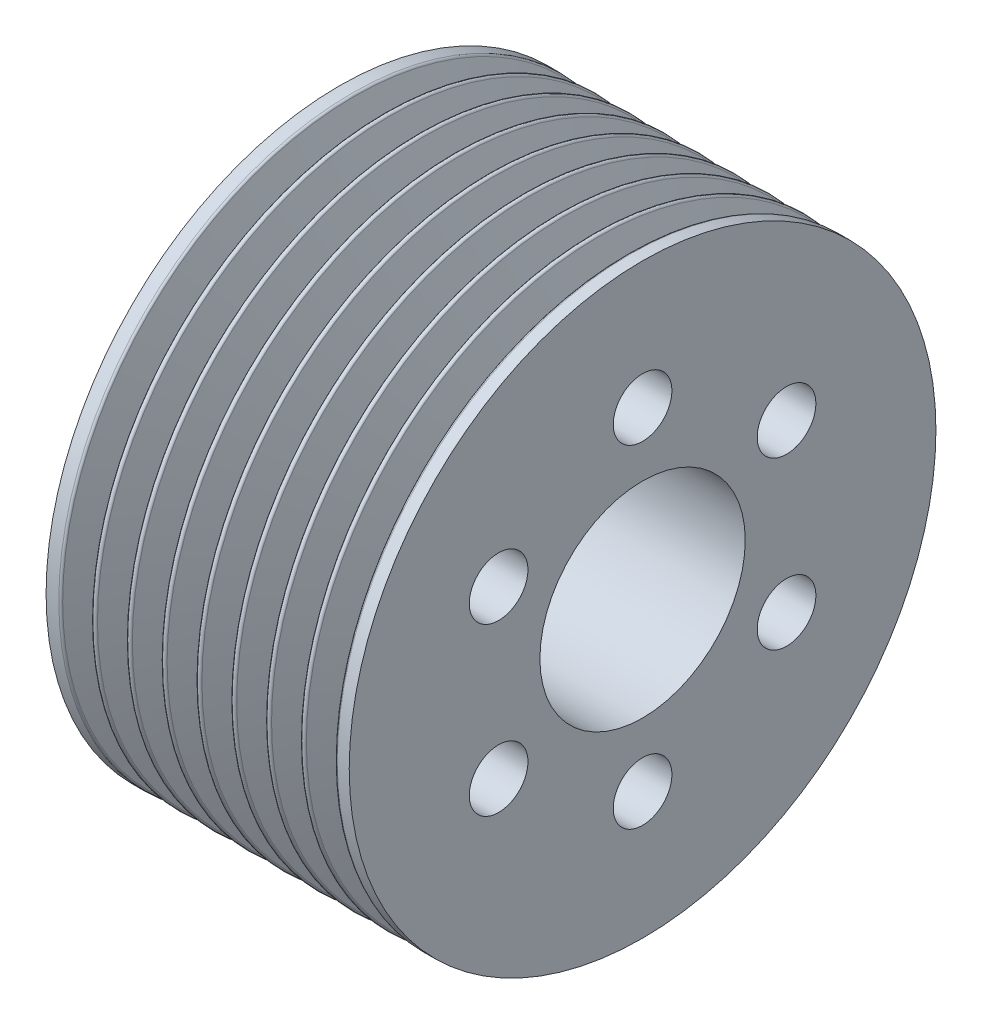
ISO-10303-21;
HEADER;
FILE_DESCRIPTION(('STEP AP214'),'2;1');
FILE_NAME('part.step','',(''),(''),'','','');
FILE_SCHEMA(('AUTOMOTIVE_DESIGN { 1 0 10303 214 1 1 1 1 }'));
ENDSEC;
DATA;
#1=APPLICATION_CONTEXT('core data for automotive mechanical design processes');
#2=APPLICATION_PROTOCOL_DEFINITION('international standard','automotive_design',2000,#1);
#3=PRODUCT_CONTEXT('',#1,'mechanical');
#4=PRODUCT('Part','Part','',(#3));
#5=PRODUCT_RELATED_PRODUCT_CATEGORY('part','',(#4));
#6=PRODUCT_DEFINITION_FORMATION('','',#4);
#7=PRODUCT_DEFINITION_CONTEXT('part definition',#1,'design');
#8=PRODUCT_DEFINITION('design','',#6,#7);
#9=PRODUCT_DEFINITION_SHAPE('','',#8);
#10=(LENGTH_UNIT() NAMED_UNIT(*) SI_UNIT(.MILLI.,.METRE.));
#11=(NAMED_UNIT(*) PLANE_ANGLE_UNIT() SI_UNIT($,.RADIAN.));
#12=(NAMED_UNIT(*) SI_UNIT($,.STERADIAN.) SOLID_ANGLE_UNIT());
#13=UNCERTAINTY_MEASURE_WITH_UNIT(LENGTH_MEASURE(1.E-05),#10,'distance_accuracy_value','');
#14=(GEOMETRIC_REPRESENTATION_CONTEXT(3) GLOBAL_UNCERTAINTY_ASSIGNED_CONTEXT((#13)) GLOBAL_UNIT_ASSIGNED_CONTEXT((#10,
#11,#12)) REPRESENTATION_CONTEXT('',''));
#15=CARTESIAN_POINT('',(0.,0.,0.));
#16=DIRECTION('',(0.,0.,1.));
#17=DIRECTION('',(1.,0.,0.));
#18=AXIS2_PLACEMENT_3D('',#15,#16,#17);
#19=CARTESIAN_POINT('',(0.,0.,0.));
#20=DIRECTION('',(-1.,0.,0.));
#21=DIRECTION('',(0.,0.,1.));
#22=AXIS2_PLACEMENT_3D('',#19,#20,#21);
#23=CYLINDRICAL_SURFACE('',#22,30.);
#24=CARTESIAN_POINT('',(18.,0.,0.));
#25=DIRECTION('',(-1.,0.,0.));
#26=DIRECTION('',(0.,0.,1.));
#27=AXIS2_PLACEMENT_3D('',#24,#25,#26);
#28=CIRCLE('',#27,30.);
#29=CARTESIAN_POINT('',(18.,0.,30.));
#30=VERTEX_POINT('',#29);
#31=EDGE_CURVE('E54',#30,#30,#28,.T.);
#32=ORIENTED_EDGE('',*,*,#31,.F.);
#33=EDGE_LOOP('',(#32));
#34=FACE_BOUND('',#33,.T.);
#35=CARTESIAN_POINT('',(19.3,0.,0.));
#36=DIRECTION('',(-1.,0.,0.));
#37=DIRECTION('',(0.,0.,1.));
#38=AXIS2_PLACEMENT_3D('',#35,#36,#37);
#39=CIRCLE('',#38,30.);
#40=CARTESIAN_POINT('',(19.3,0.,30.));
#41=VERTEX_POINT('',#40);
#42=EDGE_CURVE('E205',#41,#41,#39,.T.);
#43=ORIENTED_EDGE('',*,*,#42,.T.);
#44=EDGE_LOOP('',(#43));
#45=FACE_BOUND('',#44,.T.);
#46=ADVANCED_FACE('F41',(#34,#45),#23,.T.);
#47=CARTESIAN_POINT('',(31.5,10.5,0.));
#48=DIRECTION('',(1.,0.,0.));
#49=DIRECTION('',(0.,0.,-1.));
#50=AXIS2_PLACEMENT_3D('',#47,#48,#49);
#51=PLANE('',#50);
#52=CARTESIAN_POINT('',(31.5,8.50000000000017,14.7224318643354));
#53=DIRECTION('',(1.,0.,0.));
#54=DIRECTION('',(0.,0.,-1.));
#55=AXIS2_PLACEMENT_3D('',#52,#53,#54);
#56=CIRCLE('',#55,3.);
#57=CARTESIAN_POINT('',(31.5,8.50000000000017,11.7224318643354));
#58=VERTEX_POINT('',#57);
#59=EDGE_CURVE('E249',#58,#58,#56,.F.);
#60=ORIENTED_EDGE('',*,*,#59,.F.);
#61=EDGE_LOOP('',(#60));
#62=FACE_BOUND('',#61,.T.);
#63=CARTESIAN_POINT('',(31.5,-8.50000000000004,14.7224318643355));
#64=DIRECTION('',(1.,0.,0.));
#65=DIRECTION('',(0.,0.,-1.));
#66=AXIS2_PLACEMENT_3D('',#63,#64,#65);
#67=CIRCLE('',#66,3.);
#68=CARTESIAN_POINT('',(31.5,-8.50000000000004,11.7224318643355));
#69=VERTEX_POINT('',#68);
#70=EDGE_CURVE('E241',#69,#69,#67,.F.);
#71=ORIENTED_EDGE('',*,*,#70,.F.);
#72=EDGE_LOOP('',(#71));
#73=FACE_BOUND('',#72,.T.);
#74=CARTESIAN_POINT('',(31.5,-17.0000000000001,0.));
#75=DIRECTION('',(1.,0.,0.));
#76=DIRECTION('',(0.,0.,-1.));
#77=AXIS2_PLACEMENT_3D('',#74,#75,#76);
#78=CIRCLE('',#77,3.);
#79=CARTESIAN_POINT('',(31.5,-17.0000000000001,-2.99999999999996));
#80=VERTEX_POINT('',#79);
#81=EDGE_CURVE('E233',#80,#80,#78,.F.);
#82=ORIENTED_EDGE('',*,*,#81,.F.);
#83=EDGE_LOOP('',(#82));
#84=FACE_BOUND('',#83,.T.);
#85=CARTESIAN_POINT('',(31.5,-8.49999999999999,-14.7224318643355));
#86=DIRECTION('',(1.,0.,0.));
#87=DIRECTION('',(0.,0.,-1.));
#88=AXIS2_PLACEMENT_3D('',#85,#86,#87);
#89=CIRCLE('',#88,3.);
#90=CARTESIAN_POINT('',(31.5,-8.49999999999999,-17.7224318643355));
#91=VERTEX_POINT('',#90);
#92=EDGE_CURVE('E225',#91,#91,#89,.F.);
#93=ORIENTED_EDGE('',*,*,#92,.F.);
#94=EDGE_LOOP('',(#93));
#95=FACE_BOUND('',#94,.T.);
#96=CARTESIAN_POINT('',(31.5,8.5,-14.7224318643355));
#97=DIRECTION('',(1.,0.,0.));
#98=DIRECTION('',(0.,0.,-1.));
#99=AXIS2_PLACEMENT_3D('',#96,#97,#98);
#100=CIRCLE('',#99,3.);
#101=CARTESIAN_POINT('',(31.5,8.5,-17.7224318643355));
#102=VERTEX_POINT('',#101);
#103=EDGE_CURVE('E217',#102,#102,#100,.F.);
#104=ORIENTED_EDGE('',*,*,#103,.F.);
#105=EDGE_LOOP('',(#104));
#106=FACE_BOUND('',#105,.T.);
#107=CARTESIAN_POINT('',(31.5,17.,0.));
#108=DIRECTION('',(1.,0.,0.));
#109=DIRECTION('',(0.,0.,-1.));
#110=AXIS2_PLACEMENT_3D('',#107,#108,#109);
#111=CIRCLE('',#110,3.);
#112=CARTESIAN_POINT('',(31.5,17.,-3.));
#113=VERTEX_POINT('',#112);
#114=EDGE_CURVE('E209',#113,#113,#111,.F.);
#115=ORIENTED_EDGE('',*,*,#114,.F.);
#116=EDGE_LOOP('',(#115));
#117=FACE_BOUND('',#116,.T.);
#118=CARTESIAN_POINT('',(31.5,0.,0.));
#119=DIRECTION('',(-1.,0.,0.));
#120=DIRECTION('',(0.,0.,1.));
#121=AXIS2_PLACEMENT_3D('',#118,#119,#120);
#122=CIRCLE('',#121,10.5);
#123=CARTESIAN_POINT('',(31.5,0.,10.5));
#124=VERTEX_POINT('',#123);
#125=EDGE_CURVE('E69',#124,#124,#122,.T.);
#126=ORIENTED_EDGE('',*,*,#125,.F.);
#127=EDGE_LOOP('',(#126));
#128=FACE_BOUND('',#127,.T.);
#129=CARTESIAN_POINT('',(31.5,0.,0.));
#130=DIRECTION('',(-1.,0.,0.));
#131=DIRECTION('',(0.,0.,1.));
#132=AXIS2_PLACEMENT_3D('',#129,#130,#131);
#133=CIRCLE('',#132,25.);
#134=CARTESIAN_POINT('',(31.5,0.,25.));
#135=VERTEX_POINT('',#134);
#136=EDGE_CURVE('E10',#135,#135,#133,.T.);
#137=ORIENTED_EDGE('',*,*,#136,.T.);
#138=EDGE_LOOP('',(#137));
#139=FACE_BOUND('',#138,.T.);
#140=ADVANCED_FACE('F43',(#62,#73,#84,#95,#106,#117,#128,#139),#51,.F.);
#141=CARTESIAN_POINT('',(0.,0.,0.));
#142=DIRECTION('',(-1.,0.,0.));
#143=DIRECTION('',(0.,0.,1.));
#144=AXIS2_PLACEMENT_3D('',#141,#142,#143);
#145=CYLINDRICAL_SURFACE('',#144,25.);
#146=ORIENTED_EDGE('',*,*,#136,.F.);
#147=EDGE_LOOP('',(#146));
#148=FACE_BOUND('',#147,.T.);
#149=CARTESIAN_POINT('',(18.,0.,0.));
#150=DIRECTION('',(-1.,0.,0.));
#151=DIRECTION('',(0.,0.,1.));
#152=AXIS2_PLACEMENT_3D('',#149,#150,#151);
#153=CIRCLE('',#152,25.);
#154=CARTESIAN_POINT('',(18.,0.,25.));
#155=VERTEX_POINT('',#154);
#156=EDGE_CURVE('E49',#155,#155,#153,.T.);
#157=ORIENTED_EDGE('',*,*,#156,.T.);
#158=EDGE_LOOP('',(#157));
#159=FACE_BOUND('',#158,.T.);
#160=ADVANCED_FACE('F287',(#148,#159),#145,.F.);
#161=CARTESIAN_POINT('',(18.,30.,0.));
#162=DIRECTION('',(1.,0.,0.));
#163=DIRECTION('',(0.,0.,-1.));
#164=AXIS2_PLACEMENT_3D('',#161,#162,#163);
#165=PLANE('',#164);
#166=ORIENTED_EDGE('',*,*,#156,.F.);
#167=EDGE_LOOP('',(#166));
#168=FACE_BOUND('',#167,.T.);
#169=ORIENTED_EDGE('',*,*,#31,.T.);
#170=EDGE_LOOP('',(#169));
#171=FACE_BOUND('',#170,.T.);
#172=ADVANCED_FACE('F293',(#168,#171),#165,.F.);
#173=CARTESIAN_POINT('',(47.78,0.,0.));
#174=DIRECTION('',(-1.,0.,0.));
#175=DIRECTION('',(0.,0.,1.));
#176=AXIS2_PLACEMENT_3D('',#173,#174,#175);
#177=CIRCLE('',#176,30.);
#178=CARTESIAN_POINT('',(47.78,0.,30.));
#179=VERTEX_POINT('',#178);
#180=EDGE_CURVE('E89',#179,#179,#177,.T.);
#181=ORIENTED_EDGE('',*,*,#180,.F.);
#182=EDGE_LOOP('',(#181));
#183=FACE_BOUND('',#182,.T.);
#184=CARTESIAN_POINT('',(49.,0.,0.));
#185=DIRECTION('',(-1.,0.,0.));
#186=DIRECTION('',(0.,0.,1.));
#187=AXIS2_PLACEMENT_3D('',#184,#185,#186);
#188=CIRCLE('',#187,30.);
#189=CARTESIAN_POINT('',(49.,0.,30.));
#190=VERTEX_POINT('',#189);
#191=EDGE_CURVE('E59',#190,#190,#188,.T.);
#192=ORIENTED_EDGE('',*,*,#191,.T.);
#193=EDGE_LOOP('',(#192));
#194=FACE_BOUND('',#193,.T.);
#195=ADVANCED_FACE('F264',(#183,#194),#23,.T.);
#196=CARTESIAN_POINT('',(49.,10.5,0.));
#197=DIRECTION('',(-1.,0.,0.));
#198=DIRECTION('',(0.,0.,1.));
#199=AXIS2_PLACEMENT_3D('',#196,#197,#198);
#200=PLANE('',#199);
#201=CARTESIAN_POINT('',(49.,8.50000000000017,14.7224318643354));
#202=DIRECTION('',(1.,0.,0.));
#203=DIRECTION('',(0.,0.,-1.));
#204=AXIS2_PLACEMENT_3D('',#201,#202,#203);
#205=CIRCLE('',#204,3.);
#206=CARTESIAN_POINT('',(49.,8.50000000000017,11.7224318643354));
#207=VERTEX_POINT('',#206);
#208=EDGE_CURVE('E253',#207,#207,#205,.T.);
#209=ORIENTED_EDGE('',*,*,#208,.F.);
#210=EDGE_LOOP('',(#209));
#211=FACE_BOUND('',#210,.T.);
#212=CARTESIAN_POINT('',(49.,-8.50000000000004,14.7224318643355));
#213=DIRECTION('',(1.,0.,0.));
#214=DIRECTION('',(0.,0.,-1.));
#215=AXIS2_PLACEMENT_3D('',#212,#213,#214);
#216=CIRCLE('',#215,3.);
#217=CARTESIAN_POINT('',(49.,-8.50000000000004,11.7224318643355));
#218=VERTEX_POINT('',#217);
#219=EDGE_CURVE('E245',#218,#218,#216,.T.);
#220=ORIENTED_EDGE('',*,*,#219,.F.);
#221=EDGE_LOOP('',(#220));
#222=FACE_BOUND('',#221,.T.);
#223=CARTESIAN_POINT('',(49.,-17.0000000000001,0.));
#224=DIRECTION('',(1.,0.,0.));
#225=DIRECTION('',(0.,0.,-1.));
#226=AXIS2_PLACEMENT_3D('',#223,#224,#225);
#227=CIRCLE('',#226,3.);
#228=CARTESIAN_POINT('',(49.,-17.0000000000001,-2.99999999999996));
#229=VERTEX_POINT('',#228);
#230=EDGE_CURVE('E237',#229,#229,#227,.T.);
#231=ORIENTED_EDGE('',*,*,#230,.F.);
#232=EDGE_LOOP('',(#231));
#233=FACE_BOUND('',#232,.T.);
#234=CARTESIAN_POINT('',(49.,-8.49999999999999,-14.7224318643355));
#235=DIRECTION('',(1.,0.,0.));
#236=DIRECTION('',(0.,0.,-1.));
#237=AXIS2_PLACEMENT_3D('',#234,#235,#236);
#238=CIRCLE('',#237,3.);
#239=CARTESIAN_POINT('',(49.,-8.49999999999999,-17.7224318643355));
#240=VERTEX_POINT('',#239);
#241=EDGE_CURVE('E229',#240,#240,#238,.T.);
#242=ORIENTED_EDGE('',*,*,#241,.F.);
#243=EDGE_LOOP('',(#242));
#244=FACE_BOUND('',#243,.T.);
#245=CARTESIAN_POINT('',(49.,8.5,-14.7224318643355));
#246=DIRECTION('',(1.,0.,0.));
#247=DIRECTION('',(0.,0.,-1.));
#248=AXIS2_PLACEMENT_3D('',#245,#246,#247);
#249=CIRCLE('',#248,3.);
#250=CARTESIAN_POINT('',(49.,8.5,-17.7224318643355));
#251=VERTEX_POINT('',#250);
#252=EDGE_CURVE('E221',#251,#251,#249,.T.);
#253=ORIENTED_EDGE('',*,*,#252,.F.);
#254=EDGE_LOOP('',(#253));
#255=FACE_BOUND('',#254,.T.);
#256=CARTESIAN_POINT('',(49.,17.,0.));
#257=DIRECTION('',(1.,0.,0.));
#258=DIRECTION('',(0.,0.,-1.));
#259=AXIS2_PLACEMENT_3D('',#256,#257,#258);
#260=CIRCLE('',#259,3.);
#261=CARTESIAN_POINT('',(49.,17.,-3.));
#262=VERTEX_POINT('',#261);
#263=EDGE_CURVE('E213',#262,#262,#260,.T.);
#264=ORIENTED_EDGE('',*,*,#263,.F.);
#265=EDGE_LOOP('',(#264));
#266=FACE_BOUND('',#265,.T.);
#267=ORIENTED_EDGE('',*,*,#191,.F.);
#268=EDGE_LOOP('',(#267));
#269=FACE_BOUND('',#268,.T.);
#270=CARTESIAN_POINT('',(49.,0.,0.));
#271=DIRECTION('',(-1.,0.,0.));
#272=DIRECTION('',(0.,0.,1.));
#273=AXIS2_PLACEMENT_3D('',#270,#271,#272);
#274=CIRCLE('',#273,10.5);
#275=CARTESIAN_POINT('',(49.,0.,10.5));
#276=VERTEX_POINT('',#275);
#277=EDGE_CURVE('E65',#276,#276,#274,.T.);
#278=ORIENTED_EDGE('',*,*,#277,.T.);
#279=EDGE_LOOP('',(#278));
#280=FACE_BOUND('',#279,.T.);
#281=ADVANCED_FACE('F260',(#211,#222,#233,#244,#255,#266,#269,#280),#200,.F.);
#282=CARTESIAN_POINT('',(0.,0.,0.));
#283=DIRECTION('',(-1.,0.,0.));
#284=DIRECTION('',(0.,0.,1.));
#285=AXIS2_PLACEMENT_3D('',#282,#283,#284);
#286=CYLINDRICAL_SURFACE('',#285,10.5);
#287=ORIENTED_EDGE('',*,*,#277,.F.);
#288=EDGE_LOOP('',(#287));
#289=FACE_BOUND('',#288,.T.);
#290=ORIENTED_EDGE('',*,*,#125,.T.);
#291=EDGE_LOOP('',(#290));
#292=FACE_BOUND('',#291,.T.);
#293=ADVANCED_FACE('F263',(#289,#292),#286,.F.);
#294=CARTESIAN_POINT('',(47.78,0.,0.));
#295=DIRECTION('',(-1.,0.,0.));
#296=DIRECTION('',(0.,0.,1.));
#297=AXIS2_PLACEMENT_3D('',#294,#295,#296);
#298=TOROIDAL_SURFACE('',#297,29.75,0.250000000000001);
#299=ORIENTED_EDGE('',*,*,#180,.T.);
#300=EDGE_LOOP('',(#299));
#301=FACE_BOUND('',#300,.T.);
#302=CARTESIAN_POINT('',(47.5450768448035,0.,0.));
#303=DIRECTION('',(-1.,0.,0.));
#304=DIRECTION('',(0.,0.,1.));
#305=AXIS2_PLACEMENT_3D('',#302,#303,#304);
#306=CIRCLE('',#305,29.8355050358314);
#307=CARTESIAN_POINT('',(47.5450768448035,0.,29.8355050358314));
#308=VERTEX_POINT('',#307);
#309=EDGE_CURVE('E73',#308,#308,#306,.T.);
#310=ORIENTED_EDGE('',*,*,#309,.F.);
#311=EDGE_LOOP('',(#310));
#312=FACE_BOUND('',#311,.T.);
#313=ADVANCED_FACE('F282',(#301,#312),#298,.T.);
#314=CARTESIAN_POINT('',(46.2819077862358,0.,0.));
#315=DIRECTION('',(1.,0.,0.));
#316=DIRECTION('',(0.,0.,-1.));
#317=AXIS2_PLACEMENT_3D('',#314,#315,#316);
#318=CONICAL_SURFACE('',#317,26.3649765704627,1.22173047639603);
#319=ORIENTED_EDGE('',*,*,#309,.T.);
#320=EDGE_LOOP('',(#319));
#321=FACE_BOUND('',#320,.T.);
#322=CARTESIAN_POINT('',(46.2819077862358,0.,0.));
#323=DIRECTION('',(-1.,0.,0.));
#324=DIRECTION('',(0.,0.,1.));
#325=AXIS2_PLACEMENT_3D('',#322,#323,#324);
#326=CIRCLE('',#325,26.3649765704627);
#327=CARTESIAN_POINT('',(46.2819077862358,0.,26.3649765704627));
#328=VERTEX_POINT('',#327);
#329=EDGE_CURVE('E77',#328,#328,#326,.T.);
#330=ORIENTED_EDGE('',*,*,#329,.F.);
#331=EDGE_LOOP('',(#330));
#332=FACE_BOUND('',#331,.T.);
#333=ADVANCED_FACE('F445',(#321,#332),#318,.T.);
#334=CARTESIAN_POINT('',(46.,0.,0.));
#335=DIRECTION('',(-1.,0.,0.));
#336=DIRECTION('',(0.,0.,1.));
#337=AXIS2_PLACEMENT_3D('',#334,#335,#336);
#338=TOROIDAL_SURFACE('',#337,26.4675826134604,0.3);
#339=ORIENTED_EDGE('',*,*,#329,.T.);
#340=EDGE_LOOP('',(#339));
#341=FACE_BOUND('',#340,.T.);
#342=CARTESIAN_POINT('',(45.7180922137642,0.,0.));
#343=DIRECTION('',(-1.,0.,0.));
#344=DIRECTION('',(0.,0.,1.));
#345=AXIS2_PLACEMENT_3D('',#342,#343,#344);
#346=CIRCLE('',#345,26.3649765704627);
#347=CARTESIAN_POINT('',(45.7180922137642,0.,26.3649765704627));
#348=VERTEX_POINT('',#347);
#349=EDGE_CURVE('E81',#348,#348,#346,.T.);
#350=ORIENTED_EDGE('',*,*,#349,.F.);
#351=EDGE_LOOP('',(#350));
#352=FACE_BOUND('',#351,.T.);
#353=ADVANCED_FACE('F441',(#341,#352),#338,.F.);
#354=CARTESIAN_POINT('',(44.4549231551965,0.,0.));
#355=DIRECTION('',(-1.,0.,0.));
#356=DIRECTION('',(0.,0.,1.));
#357=AXIS2_PLACEMENT_3D('',#354,#355,#356);
#358=CONICAL_SURFACE('',#357,29.8355050358314,1.22173047639604);
#359=ORIENTED_EDGE('',*,*,#349,.T.);
#360=EDGE_LOOP('',(#359));
#361=FACE_BOUND('',#360,.T.);
#362=CARTESIAN_POINT('',(44.4549231551965,0.,0.));
#363=DIRECTION('',(-1.,0.,0.));
#364=DIRECTION('',(0.,0.,1.));
#365=AXIS2_PLACEMENT_3D('',#362,#363,#364);
#366=CIRCLE('',#365,29.8355050358314);
#367=CARTESIAN_POINT('',(44.4549231551965,0.,29.8355050358314));
#368=VERTEX_POINT('',#367);
#369=EDGE_CURVE('E85',#368,#368,#366,.T.);
#370=ORIENTED_EDGE('',*,*,#369,.F.);
#371=EDGE_LOOP('',(#370));
#372=FACE_BOUND('',#371,.T.);
#373=ADVANCED_FACE('F437',(#361,#372),#358,.T.);
#374=CARTESIAN_POINT('',(44.22,0.,0.));
#375=DIRECTION('',(-1.,0.,0.));
#376=DIRECTION('',(0.,0.,1.));
#377=AXIS2_PLACEMENT_3D('',#374,#375,#376);
#378=TOROIDAL_SURFACE('',#377,29.75,0.250000000000001);
#379=ORIENTED_EDGE('',*,*,#369,.T.);
#380=EDGE_LOOP('',(#379));
#381=FACE_BOUND('',#380,.T.);
#382=CARTESIAN_POINT('',(43.9850768448035,0.,0.));
#383=DIRECTION('',(-1.,0.,0.));
#384=DIRECTION('',(0.,0.,1.));
#385=AXIS2_PLACEMENT_3D('',#382,#383,#384);
#386=CIRCLE('',#385,29.8355050358314);
#387=CARTESIAN_POINT('',(43.9850768448035,0.,29.8355050358314));
#388=VERTEX_POINT('',#387);
#389=EDGE_CURVE('E93',#388,#388,#386,.T.);
#390=ORIENTED_EDGE('',*,*,#389,.F.);
#391=EDGE_LOOP('',(#390));
#392=FACE_BOUND('',#391,.T.);
#393=ADVANCED_FACE('F433',(#381,#392),#378,.T.);
#394=CARTESIAN_POINT('',(42.7219077862358,0.,0.));
#395=DIRECTION('',(1.,0.,0.));
#396=DIRECTION('',(0.,0.,-1.));
#397=AXIS2_PLACEMENT_3D('',#394,#395,#396);
#398=CONICAL_SURFACE('',#397,26.3649765704627,1.22173047639603);
#399=ORIENTED_EDGE('',*,*,#389,.T.);
#400=EDGE_LOOP('',(#399));
#401=FACE_BOUND('',#400,.T.);
#402=CARTESIAN_POINT('',(42.7219077862358,0.,0.));
#403=DIRECTION('',(-1.,0.,0.));
#404=DIRECTION('',(0.,0.,1.));
#405=AXIS2_PLACEMENT_3D('',#402,#403,#404);
#406=CIRCLE('',#405,26.3649765704627);
#407=CARTESIAN_POINT('',(42.7219077862358,0.,26.3649765704627));
#408=VERTEX_POINT('',#407);
#409=EDGE_CURVE('E97',#408,#408,#406,.T.);
#410=ORIENTED_EDGE('',*,*,#409,.F.);
#411=EDGE_LOOP('',(#410));
#412=FACE_BOUND('',#411,.T.);
#413=ADVANCED_FACE('F429',(#401,#412),#398,.T.);
#414=CARTESIAN_POINT('',(42.44,0.,0.));
#415=DIRECTION('',(-1.,0.,0.));
#416=DIRECTION('',(0.,0.,1.));
#417=AXIS2_PLACEMENT_3D('',#414,#415,#416);
#418=TOROIDAL_SURFACE('',#417,26.4675826134604,0.3);
#419=ORIENTED_EDGE('',*,*,#409,.T.);
#420=EDGE_LOOP('',(#419));
#421=FACE_BOUND('',#420,.T.);
#422=CARTESIAN_POINT('',(42.1580922137642,0.,0.));
#423=DIRECTION('',(-1.,0.,0.));
#424=DIRECTION('',(0.,0.,1.));
#425=AXIS2_PLACEMENT_3D('',#422,#423,#424);
#426=CIRCLE('',#425,26.3649765704627);
#427=CARTESIAN_POINT('',(42.1580922137642,0.,26.3649765704627));
#428=VERTEX_POINT('',#427);
#429=EDGE_CURVE('E101',#428,#428,#426,.T.);
#430=ORIENTED_EDGE('',*,*,#429,.F.);
#431=EDGE_LOOP('',(#430));
#432=FACE_BOUND('',#431,.T.);
#433=ADVANCED_FACE('F425',(#421,#432),#418,.F.);
#434=CARTESIAN_POINT('',(40.8949231551965,0.,0.));
#435=DIRECTION('',(-1.,0.,0.));
#436=DIRECTION('',(0.,0.,1.));
#437=AXIS2_PLACEMENT_3D('',#434,#435,#436);
#438=CONICAL_SURFACE('',#437,29.8355050358314,1.22173047639604);
#439=ORIENTED_EDGE('',*,*,#429,.T.);
#440=EDGE_LOOP('',(#439));
#441=FACE_BOUND('',#440,.T.);
#442=CARTESIAN_POINT('',(40.8949231551965,0.,0.));
#443=DIRECTION('',(-1.,0.,0.));
#444=DIRECTION('',(0.,0.,1.));
#445=AXIS2_PLACEMENT_3D('',#442,#443,#444);
#446=CIRCLE('',#445,29.8355050358314);
#447=CARTESIAN_POINT('',(40.8949231551965,0.,29.8355050358314));
#448=VERTEX_POINT('',#447);
#449=EDGE_CURVE('E105',#448,#448,#446,.T.);
#450=ORIENTED_EDGE('',*,*,#449,.F.);
#451=EDGE_LOOP('',(#450));
#452=FACE_BOUND('',#451,.T.);
#453=ADVANCED_FACE('F421',(#441,#452),#438,.T.);
#454=CARTESIAN_POINT('',(40.66,0.,0.));
#455=DIRECTION('',(-1.,0.,0.));
#456=DIRECTION('',(0.,0.,1.));
#457=AXIS2_PLACEMENT_3D('',#454,#455,#456);
#458=TOROIDAL_SURFACE('',#457,29.75,0.250000000000001);
#459=ORIENTED_EDGE('',*,*,#449,.T.);
#460=EDGE_LOOP('',(#459));
#461=FACE_BOUND('',#460,.T.);
#462=CARTESIAN_POINT('',(40.4250768448035,0.,0.));
#463=DIRECTION('',(-1.,0.,0.));
#464=DIRECTION('',(0.,0.,1.));
#465=AXIS2_PLACEMENT_3D('',#462,#463,#464);
#466=CIRCLE('',#465,29.8355050358314);
#467=CARTESIAN_POINT('',(40.4250768448035,0.,29.8355050358314));
#468=VERTEX_POINT('',#467);
#469=EDGE_CURVE('E109',#468,#468,#466,.T.);
#470=ORIENTED_EDGE('',*,*,#469,.F.);
#471=EDGE_LOOP('',(#470));
#472=FACE_BOUND('',#471,.T.);
#473=ADVANCED_FACE('F417',(#461,#472),#458,.T.);
#474=CARTESIAN_POINT('',(39.1619077862358,0.,0.));
#475=DIRECTION('',(1.,0.,0.));
#476=DIRECTION('',(0.,0.,-1.));
#477=AXIS2_PLACEMENT_3D('',#474,#475,#476);
#478=CONICAL_SURFACE('',#477,26.3649765704627,1.22173047639603);
#479=ORIENTED_EDGE('',*,*,#469,.T.);
#480=EDGE_LOOP('',(#479));
#481=FACE_BOUND('',#480,.T.);
#482=CARTESIAN_POINT('',(39.1619077862358,0.,0.));
#483=DIRECTION('',(-1.,0.,0.));
#484=DIRECTION('',(0.,0.,1.));
#485=AXIS2_PLACEMENT_3D('',#482,#483,#484);
#486=CIRCLE('',#485,26.3649765704627);
#487=CARTESIAN_POINT('',(39.1619077862358,0.,26.3649765704627));
#488=VERTEX_POINT('',#487);
#489=EDGE_CURVE('E113',#488,#488,#486,.T.);
#490=ORIENTED_EDGE('',*,*,#489,.F.);
#491=EDGE_LOOP('',(#490));
#492=FACE_BOUND('',#491,.T.);
#493=ADVANCED_FACE('F413',(#481,#492),#478,.T.);
#494=CARTESIAN_POINT('',(38.88,0.,0.));
#495=DIRECTION('',(-1.,0.,0.));
#496=DIRECTION('',(0.,0.,1.));
#497=AXIS2_PLACEMENT_3D('',#494,#495,#496);
#498=TOROIDAL_SURFACE('',#497,26.4675826134604,0.3);
#499=ORIENTED_EDGE('',*,*,#489,.T.);
#500=EDGE_LOOP('',(#499));
#501=FACE_BOUND('',#500,.T.);
#502=CARTESIAN_POINT('',(38.5980922137642,0.,0.));
#503=DIRECTION('',(-1.,0.,0.));
#504=DIRECTION('',(0.,0.,1.));
#505=AXIS2_PLACEMENT_3D('',#502,#503,#504);
#506=CIRCLE('',#505,26.3649765704627);
#507=CARTESIAN_POINT('',(38.5980922137642,0.,26.3649765704627));
#508=VERTEX_POINT('',#507);
#509=EDGE_CURVE('E117',#508,#508,#506,.T.);
#510=ORIENTED_EDGE('',*,*,#509,.F.);
#511=EDGE_LOOP('',(#510));
#512=FACE_BOUND('',#511,.T.);
#513=ADVANCED_FACE('F409',(#501,#512),#498,.F.);
#514=CARTESIAN_POINT('',(37.3349231551965,0.,0.));
#515=DIRECTION('',(-1.,0.,0.));
#516=DIRECTION('',(0.,0.,1.));
#517=AXIS2_PLACEMENT_3D('',#514,#515,#516);
#518=CONICAL_SURFACE('',#517,29.8355050358314,1.22173047639604);
#519=ORIENTED_EDGE('',*,*,#509,.T.);
#520=EDGE_LOOP('',(#519));
#521=FACE_BOUND('',#520,.T.);
#522=CARTESIAN_POINT('',(37.3349231551965,0.,0.));
#523=DIRECTION('',(-1.,0.,0.));
#524=DIRECTION('',(0.,0.,1.));
#525=AXIS2_PLACEMENT_3D('',#522,#523,#524);
#526=CIRCLE('',#525,29.8355050358314);
#527=CARTESIAN_POINT('',(37.3349231551965,0.,29.8355050358314));
#528=VERTEX_POINT('',#527);
#529=EDGE_CURVE('E121',#528,#528,#526,.T.);
#530=ORIENTED_EDGE('',*,*,#529,.F.);
#531=EDGE_LOOP('',(#530));
#532=FACE_BOUND('',#531,.T.);
#533=ADVANCED_FACE('F405',(#521,#532),#518,.T.);
#534=CARTESIAN_POINT('',(37.1,0.,0.));
#535=DIRECTION('',(-1.,0.,0.));
#536=DIRECTION('',(0.,0.,1.));
#537=AXIS2_PLACEMENT_3D('',#534,#535,#536);
#538=TOROIDAL_SURFACE('',#537,29.75,0.250000000000001);
#539=ORIENTED_EDGE('',*,*,#529,.T.);
#540=EDGE_LOOP('',(#539));
#541=FACE_BOUND('',#540,.T.);
#542=CARTESIAN_POINT('',(36.8650768448035,0.,0.));
#543=DIRECTION('',(-1.,0.,0.));
#544=DIRECTION('',(0.,0.,1.));
#545=AXIS2_PLACEMENT_3D('',#542,#543,#544);
#546=CIRCLE('',#545,29.8355050358314);
#547=CARTESIAN_POINT('',(36.8650768448035,0.,29.8355050358314));
#548=VERTEX_POINT('',#547);
#549=EDGE_CURVE('E125',#548,#548,#546,.T.);
#550=ORIENTED_EDGE('',*,*,#549,.F.);
#551=EDGE_LOOP('',(#550));
#552=FACE_BOUND('',#551,.T.);
#553=ADVANCED_FACE('F401',(#541,#552),#538,.T.);
#554=CARTESIAN_POINT('',(35.6019077862358,0.,0.));
#555=DIRECTION('',(1.,0.,0.));
#556=DIRECTION('',(0.,0.,-1.));
#557=AXIS2_PLACEMENT_3D('',#554,#555,#556);
#558=CONICAL_SURFACE('',#557,26.3649765704627,1.22173047639603);
#559=ORIENTED_EDGE('',*,*,#549,.T.);
#560=EDGE_LOOP('',(#559));
#561=FACE_BOUND('',#560,.T.);
#562=CARTESIAN_POINT('',(35.6019077862358,0.,0.));
#563=DIRECTION('',(-1.,0.,0.));
#564=DIRECTION('',(0.,0.,1.));
#565=AXIS2_PLACEMENT_3D('',#562,#563,#564);
#566=CIRCLE('',#565,26.3649765704627);
#567=CARTESIAN_POINT('',(35.6019077862358,0.,26.3649765704627));
#568=VERTEX_POINT('',#567);
#569=EDGE_CURVE('E129',#568,#568,#566,.T.);
#570=ORIENTED_EDGE('',*,*,#569,.F.);
#571=EDGE_LOOP('',(#570));
#572=FACE_BOUND('',#571,.T.);
#573=ADVANCED_FACE('F397',(#561,#572),#558,.T.);
#574=CARTESIAN_POINT('',(35.32,0.,0.));
#575=DIRECTION('',(-1.,0.,0.));
#576=DIRECTION('',(0.,0.,1.));
#577=AXIS2_PLACEMENT_3D('',#574,#575,#576);
#578=TOROIDAL_SURFACE('',#577,26.4675826134604,0.3);
#579=ORIENTED_EDGE('',*,*,#569,.T.);
#580=EDGE_LOOP('',(#579));
#581=FACE_BOUND('',#580,.T.);
#582=CARTESIAN_POINT('',(35.0380922137642,0.,0.));
#583=DIRECTION('',(-1.,0.,0.));
#584=DIRECTION('',(0.,0.,1.));
#585=AXIS2_PLACEMENT_3D('',#582,#583,#584);
#586=CIRCLE('',#585,26.3649765704627);
#587=CARTESIAN_POINT('',(35.0380922137642,0.,26.3649765704627));
#588=VERTEX_POINT('',#587);
#589=EDGE_CURVE('E133',#588,#588,#586,.T.);
#590=ORIENTED_EDGE('',*,*,#589,.F.);
#591=EDGE_LOOP('',(#590));
#592=FACE_BOUND('',#591,.T.);
#593=ADVANCED_FACE('F393',(#581,#592),#578,.F.);
#594=CARTESIAN_POINT('',(33.7749231551965,0.,0.));
#595=DIRECTION('',(-1.,0.,0.));
#596=DIRECTION('',(0.,0.,1.));
#597=AXIS2_PLACEMENT_3D('',#594,#595,#596);
#598=CONICAL_SURFACE('',#597,29.8355050358314,1.22173047639604);
#599=ORIENTED_EDGE('',*,*,#589,.T.);
#600=EDGE_LOOP('',(#599));
#601=FACE_BOUND('',#600,.T.);
#602=CARTESIAN_POINT('',(33.7749231551965,0.,0.));
#603=DIRECTION('',(-1.,0.,0.));
#604=DIRECTION('',(0.,0.,1.));
#605=AXIS2_PLACEMENT_3D('',#602,#603,#604);
#606=CIRCLE('',#605,29.8355050358314);
#607=CARTESIAN_POINT('',(33.7749231551965,0.,29.8355050358314));
#608=VERTEX_POINT('',#607);
#609=EDGE_CURVE('E137',#608,#608,#606,.T.);
#610=ORIENTED_EDGE('',*,*,#609,.F.);
#611=EDGE_LOOP('',(#610));
#612=FACE_BOUND('',#611,.T.);
#613=ADVANCED_FACE('F389',(#601,#612),#598,.T.);
#614=CARTESIAN_POINT('',(33.54,0.,0.));
#615=DIRECTION('',(-1.,0.,0.));
#616=DIRECTION('',(0.,0.,1.));
#617=AXIS2_PLACEMENT_3D('',#614,#615,#616);
#618=TOROIDAL_SURFACE('',#617,29.75,0.250000000000001);
#619=ORIENTED_EDGE('',*,*,#609,.T.);
#620=EDGE_LOOP('',(#619));
#621=FACE_BOUND('',#620,.T.);
#622=CARTESIAN_POINT('',(33.3050768448035,0.,0.));
#623=DIRECTION('',(-1.,0.,0.));
#624=DIRECTION('',(0.,0.,1.));
#625=AXIS2_PLACEMENT_3D('',#622,#623,#624);
#626=CIRCLE('',#625,29.8355050358314);
#627=CARTESIAN_POINT('',(33.3050768448035,0.,29.8355050358314));
#628=VERTEX_POINT('',#627);
#629=EDGE_CURVE('E141',#628,#628,#626,.T.);
#630=ORIENTED_EDGE('',*,*,#629,.F.);
#631=EDGE_LOOP('',(#630));
#632=FACE_BOUND('',#631,.T.);
#633=ADVANCED_FACE('F385',(#621,#632),#618,.T.);
#634=CARTESIAN_POINT('',(32.0419077862358,0.,0.));
#635=DIRECTION('',(1.,0.,0.));
#636=DIRECTION('',(0.,0.,-1.));
#637=AXIS2_PLACEMENT_3D('',#634,#635,#636);
#638=CONICAL_SURFACE('',#637,26.3649765704627,1.22173047639603);
#639=ORIENTED_EDGE('',*,*,#629,.T.);
#640=EDGE_LOOP('',(#639));
#641=FACE_BOUND('',#640,.T.);
#642=CARTESIAN_POINT('',(32.0419077862358,0.,0.));
#643=DIRECTION('',(-1.,0.,0.));
#644=DIRECTION('',(0.,0.,1.));
#645=AXIS2_PLACEMENT_3D('',#642,#643,#644);
#646=CIRCLE('',#645,26.3649765704627);
#647=CARTESIAN_POINT('',(32.0419077862358,0.,26.3649765704627));
#648=VERTEX_POINT('',#647);
#649=EDGE_CURVE('E145',#648,#648,#646,.T.);
#650=ORIENTED_EDGE('',*,*,#649,.F.);
#651=EDGE_LOOP('',(#650));
#652=FACE_BOUND('',#651,.T.);
#653=ADVANCED_FACE('F381',(#641,#652),#638,.T.);
#654=CARTESIAN_POINT('',(31.76,0.,0.));
#655=DIRECTION('',(-1.,0.,0.));
#656=DIRECTION('',(0.,0.,1.));
#657=AXIS2_PLACEMENT_3D('',#654,#655,#656);
#658=TOROIDAL_SURFACE('',#657,26.4675826134604,0.3);
#659=ORIENTED_EDGE('',*,*,#649,.T.);
#660=EDGE_LOOP('',(#659));
#661=FACE_BOUND('',#660,.T.);
#662=CARTESIAN_POINT('',(31.4780922137642,0.,0.));
#663=DIRECTION('',(-1.,0.,0.));
#664=DIRECTION('',(0.,0.,1.));
#665=AXIS2_PLACEMENT_3D('',#662,#663,#664);
#666=CIRCLE('',#665,26.3649765704627);
#667=CARTESIAN_POINT('',(31.4780922137642,0.,26.3649765704627));
#668=VERTEX_POINT('',#667);
#669=EDGE_CURVE('E149',#668,#668,#666,.T.);
#670=ORIENTED_EDGE('',*,*,#669,.F.);
#671=EDGE_LOOP('',(#670));
#672=FACE_BOUND('',#671,.T.);
#673=ADVANCED_FACE('F377',(#661,#672),#658,.F.);
#674=CARTESIAN_POINT('',(30.2149231551965,0.,0.));
#675=DIRECTION('',(-1.,0.,0.));
#676=DIRECTION('',(0.,0.,1.));
#677=AXIS2_PLACEMENT_3D('',#674,#675,#676);
#678=CONICAL_SURFACE('',#677,29.8355050358314,1.22173047639604);
#679=ORIENTED_EDGE('',*,*,#669,.T.);
#680=EDGE_LOOP('',(#679));
#681=FACE_BOUND('',#680,.T.);
#682=CARTESIAN_POINT('',(30.2149231551965,0.,0.));
#683=DIRECTION('',(-1.,0.,0.));
#684=DIRECTION('',(0.,0.,1.));
#685=AXIS2_PLACEMENT_3D('',#682,#683,#684);
#686=CIRCLE('',#685,29.8355050358314);
#687=CARTESIAN_POINT('',(30.2149231551965,0.,29.8355050358314));
#688=VERTEX_POINT('',#687);
#689=EDGE_CURVE('E153',#688,#688,#686,.T.);
#690=ORIENTED_EDGE('',*,*,#689,.F.);
#691=EDGE_LOOP('',(#690));
#692=FACE_BOUND('',#691,.T.);
#693=ADVANCED_FACE('F373',(#681,#692),#678,.T.);
#694=CARTESIAN_POINT('',(29.98,0.,0.));
#695=DIRECTION('',(-1.,0.,0.));
#696=DIRECTION('',(0.,0.,1.));
#697=AXIS2_PLACEMENT_3D('',#694,#695,#696);
#698=TOROIDAL_SURFACE('',#697,29.75,0.250000000000001);
#699=ORIENTED_EDGE('',*,*,#689,.T.);
#700=EDGE_LOOP('',(#699));
#701=FACE_BOUND('',#700,.T.);
#702=CARTESIAN_POINT('',(29.7450768448035,0.,0.));
#703=DIRECTION('',(-1.,0.,0.));
#704=DIRECTION('',(0.,0.,1.));
#705=AXIS2_PLACEMENT_3D('',#702,#703,#704);
#706=CIRCLE('',#705,29.8355050358314);
#707=CARTESIAN_POINT('',(29.7450768448035,0.,29.8355050358314));
#708=VERTEX_POINT('',#707);
#709=EDGE_CURVE('E157',#708,#708,#706,.T.);
#710=ORIENTED_EDGE('',*,*,#709,.F.);
#711=EDGE_LOOP('',(#710));
#712=FACE_BOUND('',#711,.T.);
#713=ADVANCED_FACE('F369',(#701,#712),#698,.T.);
#714=CARTESIAN_POINT('',(28.4819077862358,0.,0.));
#715=DIRECTION('',(1.,0.,0.));
#716=DIRECTION('',(0.,0.,-1.));
#717=AXIS2_PLACEMENT_3D('',#714,#715,#716);
#718=CONICAL_SURFACE('',#717,26.3649765704627,1.22173047639603);
#719=ORIENTED_EDGE('',*,*,#709,.T.);
#720=EDGE_LOOP('',(#719));
#721=FACE_BOUND('',#720,.T.);
#722=CARTESIAN_POINT('',(28.4819077862358,0.,0.));
#723=DIRECTION('',(-1.,0.,0.));
#724=DIRECTION('',(0.,0.,1.));
#725=AXIS2_PLACEMENT_3D('',#722,#723,#724);
#726=CIRCLE('',#725,26.3649765704627);
#727=CARTESIAN_POINT('',(28.4819077862358,0.,26.3649765704627));
#728=VERTEX_POINT('',#727);
#729=EDGE_CURVE('E161',#728,#728,#726,.T.);
#730=ORIENTED_EDGE('',*,*,#729,.F.);
#731=EDGE_LOOP('',(#730));
#732=FACE_BOUND('',#731,.T.);
#733=ADVANCED_FACE('F365',(#721,#732),#718,.T.);
#734=CARTESIAN_POINT('',(28.2,0.,0.));
#735=DIRECTION('',(-1.,0.,0.));
#736=DIRECTION('',(0.,0.,1.));
#737=AXIS2_PLACEMENT_3D('',#734,#735,#736);
#738=TOROIDAL_SURFACE('',#737,26.4675826134604,0.3);
#739=ORIENTED_EDGE('',*,*,#729,.T.);
#740=EDGE_LOOP('',(#739));
#741=FACE_BOUND('',#740,.T.);
#742=CARTESIAN_POINT('',(27.9180922137642,0.,0.));
#743=DIRECTION('',(-1.,0.,0.));
#744=DIRECTION('',(0.,0.,1.));
#745=AXIS2_PLACEMENT_3D('',#742,#743,#744);
#746=CIRCLE('',#745,26.3649765704627);
#747=CARTESIAN_POINT('',(27.9180922137642,0.,26.3649765704627));
#748=VERTEX_POINT('',#747);
#749=EDGE_CURVE('E165',#748,#748,#746,.T.);
#750=ORIENTED_EDGE('',*,*,#749,.F.);
#751=EDGE_LOOP('',(#750));
#752=FACE_BOUND('',#751,.T.);
#753=ADVANCED_FACE('F361',(#741,#752),#738,.F.);
#754=CARTESIAN_POINT('',(26.6549231551965,0.,0.));
#755=DIRECTION('',(-1.,0.,0.));
#756=DIRECTION('',(0.,0.,1.));
#757=AXIS2_PLACEMENT_3D('',#754,#755,#756);
#758=CONICAL_SURFACE('',#757,29.8355050358314,1.22173047639604);
#759=ORIENTED_EDGE('',*,*,#749,.T.);
#760=EDGE_LOOP('',(#759));
#761=FACE_BOUND('',#760,.T.);
#762=CARTESIAN_POINT('',(26.6549231551965,0.,0.));
#763=DIRECTION('',(-1.,0.,0.));
#764=DIRECTION('',(0.,0.,1.));
#765=AXIS2_PLACEMENT_3D('',#762,#763,#764);
#766=CIRCLE('',#765,29.8355050358314);
#767=CARTESIAN_POINT('',(26.6549231551965,0.,29.8355050358314));
#768=VERTEX_POINT('',#767);
#769=EDGE_CURVE('E169',#768,#768,#766,.T.);
#770=ORIENTED_EDGE('',*,*,#769,.F.);
#771=EDGE_LOOP('',(#770));
#772=FACE_BOUND('',#771,.T.);
#773=ADVANCED_FACE('F357',(#761,#772),#758,.T.);
#774=CARTESIAN_POINT('',(26.42,0.,0.));
#775=DIRECTION('',(-1.,0.,0.));
#776=DIRECTION('',(0.,0.,1.));
#777=AXIS2_PLACEMENT_3D('',#774,#775,#776);
#778=TOROIDAL_SURFACE('',#777,29.75,0.250000000000001);
#779=ORIENTED_EDGE('',*,*,#769,.T.);
#780=EDGE_LOOP('',(#779));
#781=FACE_BOUND('',#780,.T.);
#782=CARTESIAN_POINT('',(26.1850768448035,0.,0.));
#783=DIRECTION('',(-1.,0.,0.));
#784=DIRECTION('',(0.,0.,1.));
#785=AXIS2_PLACEMENT_3D('',#782,#783,#784);
#786=CIRCLE('',#785,29.8355050358314);
#787=CARTESIAN_POINT('',(26.1850768448035,0.,29.8355050358314));
#788=VERTEX_POINT('',#787);
#789=EDGE_CURVE('E173',#788,#788,#786,.T.);
#790=ORIENTED_EDGE('',*,*,#789,.F.);
#791=EDGE_LOOP('',(#790));
#792=FACE_BOUND('',#791,.T.);
#793=ADVANCED_FACE('F353',(#781,#792),#778,.T.);
#794=CARTESIAN_POINT('',(24.9219077862358,0.,0.));
#795=DIRECTION('',(1.,0.,0.));
#796=DIRECTION('',(0.,0.,-1.));
#797=AXIS2_PLACEMENT_3D('',#794,#795,#796);
#798=CONICAL_SURFACE('',#797,26.3649765704627,1.22173047639603);
#799=ORIENTED_EDGE('',*,*,#789,.T.);
#800=EDGE_LOOP('',(#799));
#801=FACE_BOUND('',#800,.T.);
#802=CARTESIAN_POINT('',(24.9219077862358,0.,0.));
#803=DIRECTION('',(-1.,0.,0.));
#804=DIRECTION('',(0.,0.,1.));
#805=AXIS2_PLACEMENT_3D('',#802,#803,#804);
#806=CIRCLE('',#805,26.3649765704627);
#807=CARTESIAN_POINT('',(24.9219077862358,0.,26.3649765704627));
#808=VERTEX_POINT('',#807);
#809=EDGE_CURVE('E177',#808,#808,#806,.T.);
#810=ORIENTED_EDGE('',*,*,#809,.F.);
#811=EDGE_LOOP('',(#810));
#812=FACE_BOUND('',#811,.T.);
#813=ADVANCED_FACE('F349',(#801,#812),#798,.T.);
#814=CARTESIAN_POINT('',(24.64,0.,0.));
#815=DIRECTION('',(-1.,0.,0.));
#816=DIRECTION('',(0.,0.,1.));
#817=AXIS2_PLACEMENT_3D('',#814,#815,#816);
#818=TOROIDAL_SURFACE('',#817,26.4675826134604,0.3);
#819=ORIENTED_EDGE('',*,*,#809,.T.);
#820=EDGE_LOOP('',(#819));
#821=FACE_BOUND('',#820,.T.);
#822=CARTESIAN_POINT('',(24.3580922137642,0.,0.));
#823=DIRECTION('',(-1.,0.,0.));
#824=DIRECTION('',(0.,0.,1.));
#825=AXIS2_PLACEMENT_3D('',#822,#823,#824);
#826=CIRCLE('',#825,26.3649765704627);
#827=CARTESIAN_POINT('',(24.3580922137642,0.,26.3649765704627));
#828=VERTEX_POINT('',#827);
#829=EDGE_CURVE('E181',#828,#828,#826,.T.);
#830=ORIENTED_EDGE('',*,*,#829,.F.);
#831=EDGE_LOOP('',(#830));
#832=FACE_BOUND('',#831,.T.);
#833=ADVANCED_FACE('F345',(#821,#832),#818,.F.);
#834=CARTESIAN_POINT('',(23.0949231551965,0.,0.));
#835=DIRECTION('',(-1.,0.,0.));
#836=DIRECTION('',(0.,0.,1.));
#837=AXIS2_PLACEMENT_3D('',#834,#835,#836);
#838=CONICAL_SURFACE('',#837,29.8355050358314,1.22173047639604);
#839=ORIENTED_EDGE('',*,*,#829,.T.);
#840=EDGE_LOOP('',(#839));
#841=FACE_BOUND('',#840,.T.);
#842=CARTESIAN_POINT('',(23.0949231551965,0.,0.));
#843=DIRECTION('',(-1.,0.,0.));
#844=DIRECTION('',(0.,0.,1.));
#845=AXIS2_PLACEMENT_3D('',#842,#843,#844);
#846=CIRCLE('',#845,29.8355050358314);
#847=CARTESIAN_POINT('',(23.0949231551965,0.,29.8355050358314));
#848=VERTEX_POINT('',#847);
#849=EDGE_CURVE('E185',#848,#848,#846,.T.);
#850=ORIENTED_EDGE('',*,*,#849,.F.);
#851=EDGE_LOOP('',(#850));
#852=FACE_BOUND('',#851,.T.);
#853=ADVANCED_FACE('F341',(#841,#852),#838,.T.);
#854=CARTESIAN_POINT('',(22.86,0.,0.));
#855=DIRECTION('',(-1.,0.,0.));
#856=DIRECTION('',(0.,0.,1.));
#857=AXIS2_PLACEMENT_3D('',#854,#855,#856);
#858=TOROIDAL_SURFACE('',#857,29.75,0.250000000000001);
#859=ORIENTED_EDGE('',*,*,#849,.T.);
#860=EDGE_LOOP('',(#859));
#861=FACE_BOUND('',#860,.T.);
#862=CARTESIAN_POINT('',(22.6250768448035,0.,0.));
#863=DIRECTION('',(-1.,0.,0.));
#864=DIRECTION('',(0.,0.,1.));
#865=AXIS2_PLACEMENT_3D('',#862,#863,#864);
#866=CIRCLE('',#865,29.8355050358314);
#867=CARTESIAN_POINT('',(22.6250768448035,0.,29.8355050358314));
#868=VERTEX_POINT('',#867);
#869=EDGE_CURVE('E189',#868,#868,#866,.T.);
#870=ORIENTED_EDGE('',*,*,#869,.F.);
#871=EDGE_LOOP('',(#870));
#872=FACE_BOUND('',#871,.T.);
#873=ADVANCED_FACE('F337',(#861,#872),#858,.T.);
#874=CARTESIAN_POINT('',(21.3619077862358,0.,0.));
#875=DIRECTION('',(1.,0.,0.));
#876=DIRECTION('',(0.,0.,-1.));
#877=AXIS2_PLACEMENT_3D('',#874,#875,#876);
#878=CONICAL_SURFACE('',#877,26.3649765704627,1.22173047639603);
#879=ORIENTED_EDGE('',*,*,#869,.T.);
#880=EDGE_LOOP('',(#879));
#881=FACE_BOUND('',#880,.T.);
#882=CARTESIAN_POINT('',(21.3619077862358,0.,0.));
#883=DIRECTION('',(-1.,0.,0.));
#884=DIRECTION('',(0.,0.,1.));
#885=AXIS2_PLACEMENT_3D('',#882,#883,#884);
#886=CIRCLE('',#885,26.3649765704627);
#887=CARTESIAN_POINT('',(21.3619077862358,0.,26.3649765704627));
#888=VERTEX_POINT('',#887);
#889=EDGE_CURVE('E193',#888,#888,#886,.T.);
#890=ORIENTED_EDGE('',*,*,#889,.F.);
#891=EDGE_LOOP('',(#890));
#892=FACE_BOUND('',#891,.T.);
#893=ADVANCED_FACE('F333',(#881,#892),#878,.T.);
#894=CARTESIAN_POINT('',(21.08,0.,0.));
#895=DIRECTION('',(-1.,0.,0.));
#896=DIRECTION('',(0.,0.,1.));
#897=AXIS2_PLACEMENT_3D('',#894,#895,#896);
#898=TOROIDAL_SURFACE('',#897,26.4675826134604,0.3);
#899=ORIENTED_EDGE('',*,*,#889,.T.);
#900=EDGE_LOOP('',(#899));
#901=FACE_BOUND('',#900,.T.);
#902=CARTESIAN_POINT('',(20.7980922137642,0.,0.));
#903=DIRECTION('',(-1.,0.,0.));
#904=DIRECTION('',(0.,0.,1.));
#905=AXIS2_PLACEMENT_3D('',#902,#903,#904);
#906=CIRCLE('',#905,26.3649765704627);
#907=CARTESIAN_POINT('',(20.7980922137642,0.,26.3649765704627));
#908=VERTEX_POINT('',#907);
#909=EDGE_CURVE('E197',#908,#908,#906,.T.);
#910=ORIENTED_EDGE('',*,*,#909,.F.);
#911=EDGE_LOOP('',(#910));
#912=FACE_BOUND('',#911,.T.);
#913=ADVANCED_FACE('F329',(#901,#912),#898,.F.);
#914=CARTESIAN_POINT('',(19.5349231551965,0.,0.));
#915=DIRECTION('',(-1.,0.,0.));
#916=DIRECTION('',(0.,0.,1.));
#917=AXIS2_PLACEMENT_3D('',#914,#915,#916);
#918=CONICAL_SURFACE('',#917,29.8355050358314,1.22173047639604);
#919=ORIENTED_EDGE('',*,*,#909,.T.);
#920=EDGE_LOOP('',(#919));
#921=FACE_BOUND('',#920,.T.);
#922=CARTESIAN_POINT('',(19.5349231551965,0.,0.));
#923=DIRECTION('',(-1.,0.,0.));
#924=DIRECTION('',(0.,0.,1.));
#925=AXIS2_PLACEMENT_3D('',#922,#923,#924);
#926=CIRCLE('',#925,29.8355050358314);
#927=CARTESIAN_POINT('',(19.5349231551965,0.,29.8355050358314));
#928=VERTEX_POINT('',#927);
#929=EDGE_CURVE('E201',#928,#928,#926,.T.);
#930=ORIENTED_EDGE('',*,*,#929,.F.);
#931=EDGE_LOOP('',(#930));
#932=FACE_BOUND('',#931,.T.);
#933=ADVANCED_FACE('F322',(#921,#932),#918,.T.);
#934=CARTESIAN_POINT('',(19.3,0.,0.));
#935=DIRECTION('',(-1.,0.,0.));
#936=DIRECTION('',(0.,0.,1.));
#937=AXIS2_PLACEMENT_3D('',#934,#935,#936);
#938=TOROIDAL_SURFACE('',#937,29.75,0.250000000000001);
#939=ORIENTED_EDGE('',*,*,#929,.T.);
#940=EDGE_LOOP('',(#939));
#941=FACE_BOUND('',#940,.T.);
#942=ORIENTED_EDGE('',*,*,#42,.F.);
#943=EDGE_LOOP('',(#942));
#944=FACE_BOUND('',#943,.T.);
#945=ADVANCED_FACE('F313',(#941,#944),#938,.T.);
#946=CARTESIAN_POINT('',(23.0147186257614,17.,0.));
#947=DIRECTION('',(1.,0.,0.));
#948=DIRECTION('',(0.,0.,-1.));
#949=AXIS2_PLACEMENT_3D('',#946,#947,#948);
#950=CYLINDRICAL_SURFACE('',#949,3.);
#951=ORIENTED_EDGE('',*,*,#114,.T.);
#952=EDGE_LOOP('',(#951));
#953=FACE_BOUND('',#952,.T.);
#954=ORIENTED_EDGE('',*,*,#263,.T.);
#955=EDGE_LOOP('',(#954));
#956=FACE_BOUND('',#955,.T.);
#957=ADVANCED_FACE('F309',(#953,#956),#950,.F.);
#958=CARTESIAN_POINT('',(23.0147186257614,8.5,-14.7224318643355));
#959=DIRECTION('',(1.,0.,0.));
#960=DIRECTION('',(0.,0.,-1.));
#961=AXIS2_PLACEMENT_3D('',#958,#959,#960);
#962=CYLINDRICAL_SURFACE('',#961,3.);
#963=ORIENTED_EDGE('',*,*,#103,.T.);
#964=EDGE_LOOP('',(#963));
#965=FACE_BOUND('',#964,.T.);
#966=ORIENTED_EDGE('',*,*,#252,.T.);
#967=EDGE_LOOP('',(#966));
#968=FACE_BOUND('',#967,.T.);
#969=ADVANCED_FACE('F312',(#965,#968),#962,.F.);
#970=CARTESIAN_POINT('',(23.0147186257614,-8.49999999999999,-14.7224318643355));
#971=DIRECTION('',(1.,0.,0.));
#972=DIRECTION('',(0.,0.,-1.));
#973=AXIS2_PLACEMENT_3D('',#970,#971,#972);
#974=CYLINDRICAL_SURFACE('',#973,3.);
#975=ORIENTED_EDGE('',*,*,#92,.T.);
#976=EDGE_LOOP('',(#975));
#977=FACE_BOUND('',#976,.T.);
#978=ORIENTED_EDGE('',*,*,#241,.T.);
#979=EDGE_LOOP('',(#978));
#980=FACE_BOUND('',#979,.T.);
#981=ADVANCED_FACE('F319',(#977,#980),#974,.F.);
#982=CARTESIAN_POINT('',(23.0147186257614,-17.0000000000001,0.));
#983=DIRECTION('',(1.,0.,0.));
#984=DIRECTION('',(0.,0.,-1.));
#985=AXIS2_PLACEMENT_3D('',#982,#983,#984);
#986=CYLINDRICAL_SURFACE('',#985,3.);
#987=ORIENTED_EDGE('',*,*,#81,.T.);
#988=EDGE_LOOP('',(#987));
#989=FACE_BOUND('',#988,.T.);
#990=ORIENTED_EDGE('',*,*,#230,.T.);
#991=EDGE_LOOP('',(#990));
#992=FACE_BOUND('',#991,.T.);
#993=ADVANCED_FACE('F630',(#989,#992),#986,.F.);
#994=CARTESIAN_POINT('',(23.0147186257614,-8.50000000000004,14.7224318643355));
#995=DIRECTION('',(1.,0.,0.));
#996=DIRECTION('',(0.,0.,-1.));
#997=AXIS2_PLACEMENT_3D('',#994,#995,#996);
#998=CYLINDRICAL_SURFACE('',#997,3.);
#999=ORIENTED_EDGE('',*,*,#70,.T.);
#1000=EDGE_LOOP('',(#999));
#1001=FACE_BOUND('',#1000,.T.);
#1002=ORIENTED_EDGE('',*,*,#219,.T.);
#1003=EDGE_LOOP('',(#1002));
#1004=FACE_BOUND('',#1003,.T.);
#1005=ADVANCED_FACE('F639',(#1001,#1004),#998,.F.);
#1006=CARTESIAN_POINT('',(23.0147186257614,8.50000000000017,14.7224318643354));
#1007=DIRECTION('',(1.,0.,0.));
#1008=DIRECTION('',(0.,0.,-1.));
#1009=AXIS2_PLACEMENT_3D('',#1006,#1007,#1008);
#1010=CYLINDRICAL_SURFACE('',#1009,3.);
#1011=ORIENTED_EDGE('',*,*,#59,.T.);
#1012=EDGE_LOOP('',(#1011));
#1013=FACE_BOUND('',#1012,.T.);
#1014=ORIENTED_EDGE('',*,*,#208,.T.);
#1015=EDGE_LOOP('',(#1014));
#1016=FACE_BOUND('',#1015,.T.);
#1017=ADVANCED_FACE('F258',(#1013,#1016),#1010,.F.);
#1018=CLOSED_SHELL('',(#46,#140,#160,#172,#195,#281,#293,#313,#333,#353,#373,#393,#413,#433,
#453,#473,#493,#513,#533,#553,#573,#593,#613,#633,#653,#673,#693,#713,#733,#753,#773,#793,#813,
#833,#853,#873,#893,#913,#933,#945,#957,#969,#981,#993,#1005,#1017));
#1019=MANIFOLD_SOLID_BREP('B2',#1018);
#1020=ADVANCED_BREP_SHAPE_REPRESENTATION('',(#18,#1019),#14);
#1021=SHAPE_DEFINITION_REPRESENTATION(#9,#1020);
ENDSEC;
END-ISO-10303-21;
